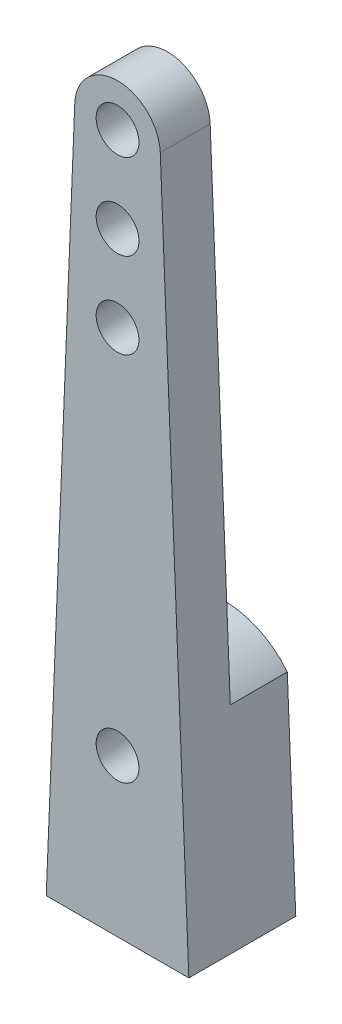
ISO-10303-21;
HEADER;
FILE_DESCRIPTION(('STEP AP214'),'2;1');
FILE_NAME('part.step','',(''),(''),'','','');
FILE_SCHEMA(('AUTOMOTIVE_DESIGN { 1 0 10303 214 1 1 1 1 }'));
ENDSEC;
DATA;
#1=APPLICATION_CONTEXT('core data for automotive mechanical design processes');
#2=APPLICATION_PROTOCOL_DEFINITION('international standard','automotive_design',2000,#1);
#3=PRODUCT_CONTEXT('',#1,'mechanical');
#4=PRODUCT('Part','Part','',(#3));
#5=PRODUCT_RELATED_PRODUCT_CATEGORY('part','',(#4));
#6=PRODUCT_DEFINITION_FORMATION('','',#4);
#7=PRODUCT_DEFINITION_CONTEXT('part definition',#1,'design');
#8=PRODUCT_DEFINITION('design','',#6,#7);
#9=PRODUCT_DEFINITION_SHAPE('','',#8);
#10=(LENGTH_UNIT() NAMED_UNIT(*) SI_UNIT(.MILLI.,.METRE.));
#11=(NAMED_UNIT(*) PLANE_ANGLE_UNIT() SI_UNIT($,.RADIAN.));
#12=(NAMED_UNIT(*) SI_UNIT($,.STERADIAN.) SOLID_ANGLE_UNIT());
#13=UNCERTAINTY_MEASURE_WITH_UNIT(LENGTH_MEASURE(1.E-05),#10,'distance_accuracy_value','');
#14=(GEOMETRIC_REPRESENTATION_CONTEXT(3) GLOBAL_UNCERTAINTY_ASSIGNED_CONTEXT((#13)) GLOBAL_UNIT_ASSIGNED_CONTEXT((#10,
#11,#12)) REPRESENTATION_CONTEXT('',''));
#15=CARTESIAN_POINT('',(0.,0.,0.));
#16=DIRECTION('',(0.,0.,1.));
#17=DIRECTION('',(1.,0.,0.));
#18=AXIS2_PLACEMENT_3D('',#15,#16,#17);
#19=CARTESIAN_POINT('',(0.,49.,3.5));
#20=DIRECTION('',(0.,0.,1.));
#21=DIRECTION('',(1.,0.,0.));
#22=AXIS2_PLACEMENT_3D('',#19,#20,#21);
#23=PLANE('',#22);
#24=CARTESIAN_POINT('',(0.,11.,3.5));
#25=DIRECTION('',(0.,0.,1.));
#26=DIRECTION('',(1.,0.,0.));
#27=AXIS2_PLACEMENT_3D('',#24,#25,#26);
#28=CIRCLE('',#27,1.5);
#29=CARTESIAN_POINT('',(1.5,11.,3.5));
#30=VERTEX_POINT('',#29);
#31=EDGE_CURVE('E38',#30,#30,#28,.T.);
#32=ORIENTED_EDGE('',*,*,#31,.F.);
#33=EDGE_LOOP('',(#32));
#34=FACE_BOUND('',#33,.T.);
#35=CARTESIAN_POINT('',(0.,37.,3.5));
#36=DIRECTION('',(0.,0.,1.));
#37=DIRECTION('',(1.,0.,0.));
#38=AXIS2_PLACEMENT_3D('',#35,#36,#37);
#39=CIRCLE('',#38,1.5);
#40=CARTESIAN_POINT('',(1.5,37.,3.5));
#41=VERTEX_POINT('',#40);
#42=EDGE_CURVE('E128',#41,#41,#39,.T.);
#43=ORIENTED_EDGE('',*,*,#42,.F.);
#44=EDGE_LOOP('',(#43));
#45=FACE_BOUND('',#44,.T.);
#46=CARTESIAN_POINT('',(0.,49.,3.5));
#47=DIRECTION('',(0.,0.,1.));
#48=DIRECTION('',(1.,0.,0.));
#49=AXIS2_PLACEMENT_3D('',#46,#47,#48);
#50=CIRCLE('',#49,1.5);
#51=CARTESIAN_POINT('',(1.5,49.,3.5));
#52=VERTEX_POINT('',#51);
#53=EDGE_CURVE('E140',#52,#52,#50,.T.);
#54=ORIENTED_EDGE('',*,*,#53,.F.);
#55=EDGE_LOOP('',(#54));
#56=FACE_BOUND('',#55,.T.);
#57=DIRECTION('',(-0.0407316451218619,-0.999170122194247,0.));
#58=VECTOR('',#57,1.);
#59=CARTESIAN_POINT('',(-2.99751036658274,49.1221949353656,3.5));
#60=LINE('',#59,#58);
#61=CARTESIAN_POINT('',(-2.99751036658274,49.1221949353656,3.5));
#62=VERTEX_POINT('',#61);
#63=CARTESIAN_POINT('',(-5.,0.,3.5));
#64=VERTEX_POINT('',#63);
#65=EDGE_CURVE('E146',#62,#64,#60,.T.);
#66=ORIENTED_EDGE('',*,*,#65,.T.);
#67=DIRECTION('',(1.,0.,0.));
#68=VECTOR('',#67,1.);
#69=CARTESIAN_POINT('',(-5.,0.,3.5));
#70=LINE('',#69,#68);
#71=CARTESIAN_POINT('',(5.,0.,3.5));
#72=VERTEX_POINT('',#71);
#73=EDGE_CURVE('E81',#64,#72,#70,.T.);
#74=ORIENTED_EDGE('',*,*,#73,.T.);
#75=DIRECTION('',(-0.040731645121862,0.999170122194247,0.));
#76=VECTOR('',#75,1.);
#77=CARTESIAN_POINT('',(2.99751036658274,49.1221949353656,3.5));
#78=LINE('',#77,#76);
#79=CARTESIAN_POINT('',(2.99751036658274,49.1221949353656,3.5));
#80=VERTEX_POINT('',#79);
#81=EDGE_CURVE('E149',#72,#80,#78,.T.);
#82=ORIENTED_EDGE('',*,*,#81,.T.);
#83=CARTESIAN_POINT('',(0.,49.,3.5));
#84=DIRECTION('',(0.,0.,1.));
#85=DIRECTION('',(1.,0.,0.));
#86=AXIS2_PLACEMENT_3D('',#83,#84,#85);
#87=CIRCLE('',#86,3.);
#88=EDGE_CURVE('E59',#80,#62,#87,.T.);
#89=ORIENTED_EDGE('',*,*,#88,.T.);
#90=EDGE_LOOP('',(#66,#74,#82,#89));
#91=FACE_BOUND('',#90,.T.);
#92=CARTESIAN_POINT('',(0.,43.,3.5));
#93=DIRECTION('',(0.,0.,1.));
#94=DIRECTION('',(1.,0.,0.));
#95=AXIS2_PLACEMENT_3D('',#92,#93,#94);
#96=CIRCLE('',#95,1.5);
#97=CARTESIAN_POINT('',(1.5,43.,3.5));
#98=VERTEX_POINT('',#97);
#99=EDGE_CURVE('E134',#98,#98,#96,.T.);
#100=ORIENTED_EDGE('',*,*,#99,.F.);
#101=EDGE_LOOP('',(#100));
#102=FACE_BOUND('',#101,.T.);
#103=ADVANCED_FACE('F34',(#34,#45,#56,#91,#102),#23,.T.);
#104=CARTESIAN_POINT('',(0.,49.,0.));
#105=DIRECTION('',(0.,0.,1.));
#106=DIRECTION('',(1.,0.,0.));
#107=AXIS2_PLACEMENT_3D('',#104,#105,#106);
#108=PLANE('',#107);
#109=CARTESIAN_POINT('',(0.,11.,0.));
#110=DIRECTION('',(0.,0.,-1.));
#111=DIRECTION('',(-1.,0.,0.));
#112=AXIS2_PLACEMENT_3D('',#109,#110,#111);
#113=CIRCLE('',#112,5.65353369168121);
#114=CARTESIAN_POINT('',(-4.40722865826226,14.5410138035267,0.));
#115=VERTEX_POINT('',#114);
#116=CARTESIAN_POINT('',(4.40722865826226,14.5410138035267,0.));
#117=VERTEX_POINT('',#116);
#118=EDGE_CURVE('E50',#115,#117,#113,.T.);
#119=ORIENTED_EDGE('',*,*,#118,.F.);
#120=DIRECTION('',(-0.0407316451218619,-0.999170122194247,0.));
#121=VECTOR('',#120,1.);
#122=CARTESIAN_POINT('',(-2.99751036658274,49.1221949353656,0.));
#123=LINE('',#122,#121);
#124=CARTESIAN_POINT('',(-2.99751036658274,49.1221949353656,0.));
#125=VERTEX_POINT('',#124);
#126=EDGE_CURVE('E143',#125,#115,#123,.T.);
#127=ORIENTED_EDGE('',*,*,#126,.F.);
#128=CARTESIAN_POINT('',(0.,49.,0.));
#129=DIRECTION('',(0.,0.,1.));
#130=DIRECTION('',(1.,0.,0.));
#131=AXIS2_PLACEMENT_3D('',#128,#129,#130);
#132=CIRCLE('',#131,3.);
#133=CARTESIAN_POINT('',(2.99751036658274,49.1221949353656,0.));
#134=VERTEX_POINT('',#133);
#135=EDGE_CURVE('E74',#134,#125,#132,.T.);
#136=ORIENTED_EDGE('',*,*,#135,.F.);
#137=DIRECTION('',(-0.040731645121862,0.999170122194247,0.));
#138=VECTOR('',#137,1.);
#139=CARTESIAN_POINT('',(2.99751036658274,49.1221949353656,0.));
#140=LINE('',#139,#138);
#141=EDGE_CURVE('E154',#117,#134,#140,.T.);
#142=ORIENTED_EDGE('',*,*,#141,.F.);
#143=EDGE_LOOP('',(#119,#127,#136,#142));
#144=FACE_BOUND('',#143,.T.);
#145=CARTESIAN_POINT('',(0.,49.,0.));
#146=DIRECTION('',(0.,0.,1.));
#147=DIRECTION('',(1.,0.,0.));
#148=AXIS2_PLACEMENT_3D('',#145,#146,#147);
#149=CIRCLE('',#148,1.5);
#150=CARTESIAN_POINT('',(1.5,49.,0.));
#151=VERTEX_POINT('',#150);
#152=EDGE_CURVE('E137',#151,#151,#149,.T.);
#153=ORIENTED_EDGE('',*,*,#152,.T.);
#154=EDGE_LOOP('',(#153));
#155=FACE_BOUND('',#154,.T.);
#156=CARTESIAN_POINT('',(0.,43.,0.));
#157=DIRECTION('',(0.,0.,1.));
#158=DIRECTION('',(1.,0.,0.));
#159=AXIS2_PLACEMENT_3D('',#156,#157,#158);
#160=CIRCLE('',#159,1.5);
#161=CARTESIAN_POINT('',(1.5,43.,0.));
#162=VERTEX_POINT('',#161);
#163=EDGE_CURVE('E131',#162,#162,#160,.T.);
#164=ORIENTED_EDGE('',*,*,#163,.T.);
#165=EDGE_LOOP('',(#164));
#166=FACE_BOUND('',#165,.T.);
#167=CARTESIAN_POINT('',(0.,37.,0.));
#168=DIRECTION('',(0.,0.,1.));
#169=DIRECTION('',(1.,0.,0.));
#170=AXIS2_PLACEMENT_3D('',#167,#168,#169);
#171=CIRCLE('',#170,1.5);
#172=CARTESIAN_POINT('',(1.5,37.,0.));
#173=VERTEX_POINT('',#172);
#174=EDGE_CURVE('E127',#173,#173,#171,.T.);
#175=ORIENTED_EDGE('',*,*,#174,.T.);
#176=EDGE_LOOP('',(#175));
#177=FACE_BOUND('',#176,.T.);
#178=ADVANCED_FACE('F165',(#144,#155,#166,#177),#108,.F.);
#179=CARTESIAN_POINT('',(-2.99751036658274,49.1221949353656,3.5));
#180=DIRECTION('',(0.999170122194247,-0.0407316451218619,0.));
#181=DIRECTION('',(0.0407316451218619,0.999170122194247,0.));
#182=AXIS2_PLACEMENT_3D('',#179,#180,#181);
#183=PLANE('',#182);
#184=ORIENTED_EDGE('',*,*,#126,.T.);
#185=DIRECTION('',(0.,0.,1.));
#186=VECTOR('',#185,1.);
#187=CARTESIAN_POINT('',(-4.40722865826226,14.5410138035267,-4.));
#188=LINE('',#187,#186);
#189=CARTESIAN_POINT('',(-4.40722865826226,14.5410138035267,-4.));
#190=VERTEX_POINT('',#189);
#191=EDGE_CURVE('E105',#190,#115,#188,.T.);
#192=ORIENTED_EDGE('',*,*,#191,.F.);
#193=DIRECTION('',(0.040731645121862,0.999170122194247,0.));
#194=VECTOR('',#193,1.);
#195=CARTESIAN_POINT('',(-5.,0.,-4.));
#196=LINE('',#195,#194);
#197=CARTESIAN_POINT('',(-5.,0.,-4.));
#198=VERTEX_POINT('',#197);
#199=EDGE_CURVE('E103',#198,#190,#196,.T.);
#200=ORIENTED_EDGE('',*,*,#199,.F.);
#201=DIRECTION('',(0.,0.,-1.));
#202=VECTOR('',#201,1.);
#203=CARTESIAN_POINT('',(-5.,0.,3.5));
#204=LINE('',#203,#202);
#205=EDGE_CURVE('E11',#64,#198,#204,.T.);
#206=ORIENTED_EDGE('',*,*,#205,.F.);
#207=ORIENTED_EDGE('',*,*,#65,.F.);
#208=DIRECTION('',(0.,0.,-1.));
#209=VECTOR('',#208,1.);
#210=CARTESIAN_POINT('',(-2.99751036658274,49.1221949353656,3.5));
#211=LINE('',#210,#209);
#212=EDGE_CURVE('E152',#62,#125,#211,.T.);
#213=ORIENTED_EDGE('',*,*,#212,.T.);
#214=EDGE_LOOP('',(#184,#192,#200,#206,#207,#213));
#215=FACE_BOUND('',#214,.T.);
#216=ADVANCED_FACE('F36',(#215),#183,.F.);
#217=CARTESIAN_POINT('',(-5.,0.,3.5));
#218=DIRECTION('',(0.,1.,0.));
#219=DIRECTION('',(0.,0.,1.));
#220=AXIS2_PLACEMENT_3D('',#217,#218,#219);
#221=PLANE('',#220);
#222=ORIENTED_EDGE('',*,*,#205,.T.);
#223=DIRECTION('',(-1.,0.,0.));
#224=VECTOR('',#223,1.);
#225=CARTESIAN_POINT('',(5.,0.,-4.));
#226=LINE('',#225,#224);
#227=CARTESIAN_POINT('',(5.,0.,-4.));
#228=VERTEX_POINT('',#227);
#229=EDGE_CURVE('E99',#228,#198,#226,.T.);
#230=ORIENTED_EDGE('',*,*,#229,.F.);
#231=DIRECTION('',(0.,0.,-1.));
#232=VECTOR('',#231,1.);
#233=CARTESIAN_POINT('',(5.,0.,3.5));
#234=LINE('',#233,#232);
#235=EDGE_CURVE('E43',#72,#228,#234,.T.);
#236=ORIENTED_EDGE('',*,*,#235,.F.);
#237=ORIENTED_EDGE('',*,*,#73,.F.);
#238=EDGE_LOOP('',(#222,#230,#236,#237));
#239=FACE_BOUND('',#238,.T.);
#240=ADVANCED_FACE('F97',(#239),#221,.F.);
#241=CARTESIAN_POINT('',(2.99751036658274,49.1221949353656,3.5));
#242=DIRECTION('',(-0.999170122194247,-0.040731645121862,0.));
#243=DIRECTION('',(0.040731645121862,-0.999170122194247,0.));
#244=AXIS2_PLACEMENT_3D('',#241,#242,#243);
#245=PLANE('',#244);
#246=ORIENTED_EDGE('',*,*,#235,.T.);
#247=DIRECTION('',(0.0407316451218621,-0.999170122194247,0.));
#248=VECTOR('',#247,1.);
#249=CARTESIAN_POINT('',(4.40722865826226,14.5410138035267,-4.));
#250=LINE('',#249,#248);
#251=CARTESIAN_POINT('',(4.40722865826226,14.5410138035267,-4.));
#252=VERTEX_POINT('',#251);
#253=EDGE_CURVE('E113',#252,#228,#250,.T.);
#254=ORIENTED_EDGE('',*,*,#253,.F.);
#255=DIRECTION('',(0.,0.,1.));
#256=VECTOR('',#255,1.);
#257=CARTESIAN_POINT('',(4.40722865826226,14.5410138035267,-4.));
#258=LINE('',#257,#256);
#259=EDGE_CURVE('E122',#252,#117,#258,.T.);
#260=ORIENTED_EDGE('',*,*,#259,.T.);
#261=ORIENTED_EDGE('',*,*,#141,.T.);
#262=DIRECTION('',(0.,0.,-1.));
#263=VECTOR('',#262,1.);
#264=CARTESIAN_POINT('',(2.99751036658274,49.1221949353656,3.5));
#265=LINE('',#264,#263);
#266=EDGE_CURVE('E158',#80,#134,#265,.T.);
#267=ORIENTED_EDGE('',*,*,#266,.F.);
#268=ORIENTED_EDGE('',*,*,#81,.F.);
#269=EDGE_LOOP('',(#246,#254,#260,#261,#267,#268));
#270=FACE_BOUND('',#269,.T.);
#271=ADVANCED_FACE('F162',(#270),#245,.F.);
#272=CARTESIAN_POINT('',(0.,49.,3.5));
#273=DIRECTION('',(0.,0.,-1.));
#274=DIRECTION('',(-1.,0.,0.));
#275=AXIS2_PLACEMENT_3D('',#272,#273,#274);
#276=CYLINDRICAL_SURFACE('',#275,3.);
#277=ORIENTED_EDGE('',*,*,#135,.T.);
#278=ORIENTED_EDGE('',*,*,#212,.F.);
#279=ORIENTED_EDGE('',*,*,#88,.F.);
#280=ORIENTED_EDGE('',*,*,#266,.T.);
#281=EDGE_LOOP('',(#277,#278,#279,#280));
#282=FACE_BOUND('',#281,.T.);
#283=ADVANCED_FACE('F197',(#282),#276,.T.);
#284=CARTESIAN_POINT('',(0.,49.,3.5));
#285=DIRECTION('',(0.,0.,-1.));
#286=DIRECTION('',(-1.,0.,0.));
#287=AXIS2_PLACEMENT_3D('',#284,#285,#286);
#288=CYLINDRICAL_SURFACE('',#287,1.5);
#289=ORIENTED_EDGE('',*,*,#53,.T.);
#290=EDGE_LOOP('',(#289));
#291=FACE_BOUND('',#290,.T.);
#292=ORIENTED_EDGE('',*,*,#152,.F.);
#293=EDGE_LOOP('',(#292));
#294=FACE_BOUND('',#293,.T.);
#295=ADVANCED_FACE('F194',(#291,#294),#288,.F.);
#296=CARTESIAN_POINT('',(0.,43.,3.5));
#297=DIRECTION('',(0.,0.,-1.));
#298=DIRECTION('',(-1.,0.,0.));
#299=AXIS2_PLACEMENT_3D('',#296,#297,#298);
#300=CYLINDRICAL_SURFACE('',#299,1.5);
#301=ORIENTED_EDGE('',*,*,#99,.T.);
#302=EDGE_LOOP('',(#301));
#303=FACE_BOUND('',#302,.T.);
#304=ORIENTED_EDGE('',*,*,#163,.F.);
#305=EDGE_LOOP('',(#304));
#306=FACE_BOUND('',#305,.T.);
#307=ADVANCED_FACE('F222',(#303,#306),#300,.F.);
#308=CARTESIAN_POINT('',(0.,37.,3.5));
#309=DIRECTION('',(0.,0.,-1.));
#310=DIRECTION('',(-1.,0.,0.));
#311=AXIS2_PLACEMENT_3D('',#308,#309,#310);
#312=CYLINDRICAL_SURFACE('',#311,1.5);
#313=ORIENTED_EDGE('',*,*,#42,.T.);
#314=EDGE_LOOP('',(#313));
#315=FACE_BOUND('',#314,.T.);
#316=ORIENTED_EDGE('',*,*,#174,.F.);
#317=EDGE_LOOP('',(#316));
#318=FACE_BOUND('',#317,.T.);
#319=ADVANCED_FACE('F180',(#315,#318),#312,.F.);
#320=CARTESIAN_POINT('',(0.,11.,-4.));
#321=DIRECTION('',(0.,0.,-1.));
#322=DIRECTION('',(-1.,0.,0.));
#323=AXIS2_PLACEMENT_3D('',#320,#321,#322);
#324=PLANE('',#323);
#325=CARTESIAN_POINT('',(0.,11.,-4.));
#326=DIRECTION('',(0.,0.,-1.));
#327=DIRECTION('',(-1.,0.,0.));
#328=AXIS2_PLACEMENT_3D('',#325,#326,#327);
#329=CIRCLE('',#328,2.75);
#330=CARTESIAN_POINT('',(-2.75,11.,-4.));
#331=VERTEX_POINT('',#330);
#332=EDGE_CURVE('E118',#331,#331,#329,.T.);
#333=ORIENTED_EDGE('',*,*,#332,.F.);
#334=EDGE_LOOP('',(#333));
#335=FACE_BOUND('',#334,.T.);
#336=ORIENTED_EDGE('',*,*,#229,.T.);
#337=ORIENTED_EDGE('',*,*,#199,.T.);
#338=CARTESIAN_POINT('',(0.,11.,-4.));
#339=DIRECTION('',(0.,0.,-1.));
#340=DIRECTION('',(-1.,0.,0.));
#341=AXIS2_PLACEMENT_3D('',#338,#339,#340);
#342=CIRCLE('',#341,5.65353369168121);
#343=EDGE_CURVE('E108',#190,#252,#342,.T.);
#344=ORIENTED_EDGE('',*,*,#343,.T.);
#345=ORIENTED_EDGE('',*,*,#253,.T.);
#346=EDGE_LOOP('',(#336,#337,#344,#345));
#347=FACE_BOUND('',#346,.T.);
#348=ADVANCED_FACE('F111',(#335,#347),#324,.T.);
#349=CARTESIAN_POINT('',(0.,11.,-4.));
#350=DIRECTION('',(0.,0.,1.));
#351=DIRECTION('',(1.,0.,0.));
#352=AXIS2_PLACEMENT_3D('',#349,#350,#351);
#353=CYLINDRICAL_SURFACE('',#352,5.65353369168121);
#354=ORIENTED_EDGE('',*,*,#118,.T.);
#355=ORIENTED_EDGE('',*,*,#259,.F.);
#356=ORIENTED_EDGE('',*,*,#343,.F.);
#357=ORIENTED_EDGE('',*,*,#191,.T.);
#358=EDGE_LOOP('',(#354,#355,#356,#357));
#359=FACE_BOUND('',#358,.T.);
#360=ADVANCED_FACE('F169',(#359),#353,.T.);
#361=CARTESIAN_POINT('',(0.,11.,0.));
#362=DIRECTION('',(0.,0.,-1.));
#363=DIRECTION('',(-1.,0.,0.));
#364=AXIS2_PLACEMENT_3D('',#361,#362,#363);
#365=CYLINDRICAL_SURFACE('',#364,2.75);
#366=CARTESIAN_POINT('',(0.,11.,0.));
#367=DIRECTION('',(0.,0.,-1.));
#368=DIRECTION('',(-1.,0.,0.));
#369=AXIS2_PLACEMENT_3D('',#366,#367,#368);
#370=CIRCLE('',#369,2.75);
#371=CARTESIAN_POINT('',(-2.75,11.,0.));
#372=VERTEX_POINT('',#371);
#373=EDGE_CURVE('E115',#372,#372,#370,.T.);
#374=ORIENTED_EDGE('',*,*,#373,.F.);
#375=EDGE_LOOP('',(#374));
#376=FACE_BOUND('',#375,.T.);
#377=ORIENTED_EDGE('',*,*,#332,.T.);
#378=EDGE_LOOP('',(#377));
#379=FACE_BOUND('',#378,.T.);
#380=ADVANCED_FACE('F171',(#376,#379),#365,.F.);
#381=CARTESIAN_POINT('',(0.,11.,0.));
#382=DIRECTION('',(0.,0.,-1.));
#383=DIRECTION('',(-1.,0.,0.));
#384=AXIS2_PLACEMENT_3D('',#381,#382,#383);
#385=PLANE('',#384);
#386=CARTESIAN_POINT('',(0.,11.,0.));
#387=DIRECTION('',(0.,0.,-1.));
#388=DIRECTION('',(-1.,0.,0.));
#389=AXIS2_PLACEMENT_3D('',#386,#387,#388);
#390=CIRCLE('',#389,1.5);
#391=CARTESIAN_POINT('',(-1.5,11.,0.));
#392=VERTEX_POINT('',#391);
#393=EDGE_CURVE('E300',#392,#392,#390,.T.);
#394=ORIENTED_EDGE('',*,*,#393,.F.);
#395=EDGE_LOOP('',(#394));
#396=FACE_BOUND('',#395,.T.);
#397=ORIENTED_EDGE('',*,*,#373,.T.);
#398=EDGE_LOOP('',(#397));
#399=FACE_BOUND('',#398,.T.);
#400=ADVANCED_FACE('F177',(#396,#399),#385,.T.);
#401=CARTESIAN_POINT('',(0.,11.,4.));
#402=DIRECTION('',(0.,0.,-1.));
#403=DIRECTION('',(-1.,0.,0.));
#404=AXIS2_PLACEMENT_3D('',#401,#402,#403);
#405=CYLINDRICAL_SURFACE('',#404,1.5);
#406=ORIENTED_EDGE('',*,*,#31,.T.);
#407=EDGE_LOOP('',(#406));
#408=FACE_BOUND('',#407,.T.);
#409=ORIENTED_EDGE('',*,*,#393,.T.);
#410=EDGE_LOOP('',(#409));
#411=FACE_BOUND('',#410,.T.);
#412=ADVANCED_FACE('F282',(#408,#411),#405,.F.);
#413=CLOSED_SHELL('',(#103,#178,#216,#240,#271,#283,#295,#307,#319,#348,#360,#380,#400,#412));
#414=MANIFOLD_SOLID_BREP('B2',#413);
#415=ADVANCED_BREP_SHAPE_REPRESENTATION('',(#18,#414),#14);
#416=SHAPE_DEFINITION_REPRESENTATION(#9,#415);
ENDSEC;
END-ISO-10303-21;
